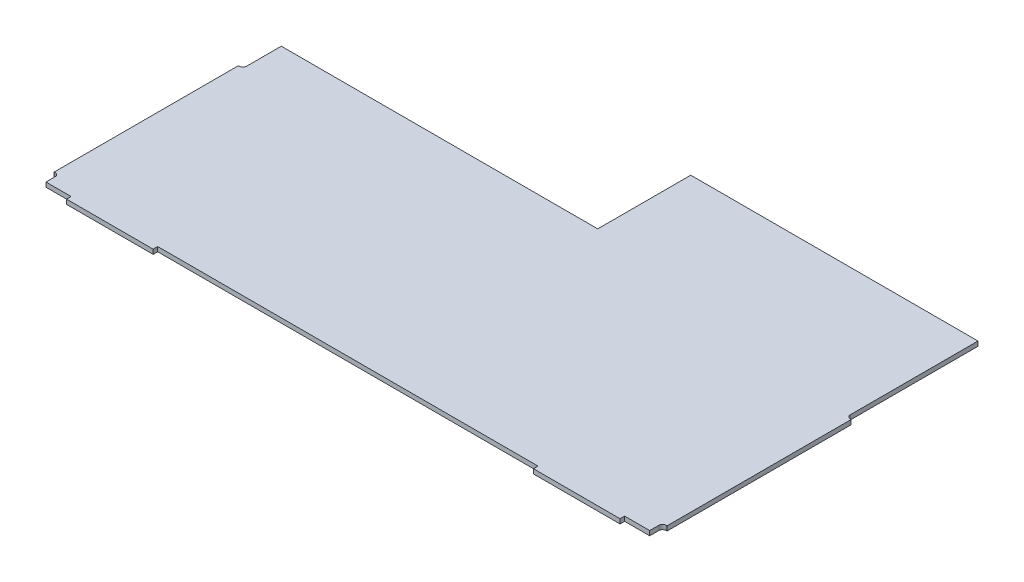
ISO-10303-21;
HEADER;
FILE_DESCRIPTION(('STEP AP214'),'2;1');
FILE_NAME('part.step','',(''),(''),'','','');
FILE_SCHEMA(('AUTOMOTIVE_DESIGN { 1 0 10303 214 1 1 1 1 }'));
ENDSEC;
DATA;
#1=APPLICATION_CONTEXT('core data for automotive mechanical design processes');
#2=APPLICATION_PROTOCOL_DEFINITION('international standard','automotive_design',2000,#1);
#3=PRODUCT_CONTEXT('',#1,'mechanical');
#4=PRODUCT('Part','Part','',(#3));
#5=PRODUCT_RELATED_PRODUCT_CATEGORY('part','',(#4));
#6=PRODUCT_DEFINITION_FORMATION('','',#4);
#7=PRODUCT_DEFINITION_CONTEXT('part definition',#1,'design');
#8=PRODUCT_DEFINITION('design','',#6,#7);
#9=PRODUCT_DEFINITION_SHAPE('','',#8);
#10=(LENGTH_UNIT() NAMED_UNIT(*) SI_UNIT(.MILLI.,.METRE.));
#11=(NAMED_UNIT(*) PLANE_ANGLE_UNIT() SI_UNIT($,.RADIAN.));
#12=(NAMED_UNIT(*) SI_UNIT($,.STERADIAN.) SOLID_ANGLE_UNIT());
#13=UNCERTAINTY_MEASURE_WITH_UNIT(LENGTH_MEASURE(1.E-05),#10,'distance_accuracy_value','');
#14=(GEOMETRIC_REPRESENTATION_CONTEXT(3) GLOBAL_UNCERTAINTY_ASSIGNED_CONTEXT((#13)) GLOBAL_UNIT_ASSIGNED_CONTEXT((#10,
#11,#12)) REPRESENTATION_CONTEXT('',''));
#15=CARTESIAN_POINT('',(0.,0.,0.));
#16=DIRECTION('',(0.,0.,1.));
#17=DIRECTION('',(1.,0.,0.));
#18=AXIS2_PLACEMENT_3D('',#15,#16,#17);
#19=CARTESIAN_POINT('',(196.370348369291,3.175,24.13));
#20=DIRECTION('',(0.,-1.,0.));
#21=DIRECTION('',(0.,0.,-1.));
#22=AXIS2_PLACEMENT_3D('',#19,#20,#21);
#23=CYLINDRICAL_SURFACE('',#22,2.54000000000001);
#24=CARTESIAN_POINT('',(196.370348369291,0.,24.13));
#25=DIRECTION('',(0.,-1.,0.));
#26=DIRECTION('',(0.,0.,1.));
#27=AXIS2_PLACEMENT_3D('',#24,#25,#26);
#28=CIRCLE('',#27,2.54000000000001);
#29=CARTESIAN_POINT('',(196.370348369291,0.,26.67));
#30=VERTEX_POINT('',#29);
#31=CARTESIAN_POINT('',(193.830348369291,0.,24.13));
#32=VERTEX_POINT('',#31);
#33=EDGE_CURVE('E235',#30,#32,#28,.T.);
#34=ORIENTED_EDGE('',*,*,#33,.T.);
#35=DIRECTION('',(0.,-1.,0.));
#36=VECTOR('',#35,1.);
#37=CARTESIAN_POINT('',(193.830348369291,3.175,24.13));
#38=LINE('',#37,#36);
#39=CARTESIAN_POINT('',(193.830348369291,3.175,24.13));
#40=VERTEX_POINT('',#39);
#41=EDGE_CURVE('E11',#40,#32,#38,.T.);
#42=ORIENTED_EDGE('',*,*,#41,.F.);
#43=CARTESIAN_POINT('',(196.370348369291,3.175,24.13));
#44=DIRECTION('',(0.,-1.,0.));
#45=DIRECTION('',(0.,0.,1.));
#46=AXIS2_PLACEMENT_3D('',#43,#44,#45);
#47=CIRCLE('',#46,2.54000000000001);
#48=CARTESIAN_POINT('',(196.370348369291,3.175,26.67));
#49=VERTEX_POINT('',#48);
#50=EDGE_CURVE('E230',#49,#40,#47,.T.);
#51=ORIENTED_EDGE('',*,*,#50,.F.);
#52=DIRECTION('',(0.,-1.,0.));
#53=VECTOR('',#52,1.);
#54=CARTESIAN_POINT('',(196.370348369291,3.175,26.67));
#55=LINE('',#54,#53);
#56=EDGE_CURVE('E225',#49,#30,#55,.T.);
#57=ORIENTED_EDGE('',*,*,#56,.T.);
#58=EDGE_LOOP('',(#34,#42,#51,#57));
#59=FACE_BOUND('',#58,.T.);
#60=ADVANCED_FACE('F36',(#59),#23,.F.);
#61=CARTESIAN_POINT('',(193.830348369291,3.175,-64.77));
#62=DIRECTION('',(-1.,0.,0.));
#63=DIRECTION('',(0.,0.,1.));
#64=AXIS2_PLACEMENT_3D('',#61,#62,#63);
#65=PLANE('',#64);
#66=DIRECTION('',(0.,0.,-1.));
#67=VECTOR('',#66,1.);
#68=CARTESIAN_POINT('',(193.830348369291,0.,-64.77));
#69=LINE('',#68,#67);
#70=CARTESIAN_POINT('',(193.830348369291,0.,-64.77));
#71=VERTEX_POINT('',#70);
#72=EDGE_CURVE('E241',#32,#71,#69,.T.);
#73=ORIENTED_EDGE('',*,*,#72,.T.);
#74=DIRECTION('',(0.,-1.,0.));
#75=VECTOR('',#74,1.);
#76=CARTESIAN_POINT('',(193.830348369291,3.175,-64.77));
#77=LINE('',#76,#75);
#78=CARTESIAN_POINT('',(193.830348369291,3.175,-64.77));
#79=VERTEX_POINT('',#78);
#80=EDGE_CURVE('E45',#79,#71,#77,.T.);
#81=ORIENTED_EDGE('',*,*,#80,.F.);
#82=DIRECTION('',(0.,0.,-1.));
#83=VECTOR('',#82,1.);
#84=CARTESIAN_POINT('',(193.830348369291,3.175,-64.77));
#85=LINE('',#84,#83);
#86=EDGE_CURVE('E408',#40,#79,#85,.T.);
#87=ORIENTED_EDGE('',*,*,#86,.F.);
#88=ORIENTED_EDGE('',*,*,#41,.T.);
#89=EDGE_LOOP('',(#73,#81,#87,#88));
#90=FACE_BOUND('',#89,.T.);
#91=ADVANCED_FACE('F410',(#90),#65,.F.);
#92=CARTESIAN_POINT('',(-6.1946516307094,3.175,-64.77));
#93=DIRECTION('',(0.,0.,1.));
#94=DIRECTION('',(1.,0.,0.));
#95=AXIS2_PLACEMENT_3D('',#92,#93,#94);
#96=PLANE('',#95);
#97=DIRECTION('',(-1.,0.,0.));
#98=VECTOR('',#97,1.);
#99=CARTESIAN_POINT('',(-6.1946516307094,0.,-64.77));
#100=LINE('',#99,#98);
#101=CARTESIAN_POINT('',(-6.1946516307094,0.,-64.77));
#102=VERTEX_POINT('',#101);
#103=EDGE_CURVE('E244',#71,#102,#100,.T.);
#104=ORIENTED_EDGE('',*,*,#103,.T.);
#105=DIRECTION('',(0.,-1.,0.));
#106=VECTOR('',#105,1.);
#107=CARTESIAN_POINT('',(-6.1946516307094,3.175,-64.77));
#108=LINE('',#107,#106);
#109=CARTESIAN_POINT('',(-6.1946516307094,3.175,-64.77));
#110=VERTEX_POINT('',#109);
#111=EDGE_CURVE('E342',#110,#102,#108,.T.);
#112=ORIENTED_EDGE('',*,*,#111,.F.);
#113=DIRECTION('',(-1.,0.,0.));
#114=VECTOR('',#113,1.);
#115=CARTESIAN_POINT('',(-6.1946516307094,3.175,-64.77));
#116=LINE('',#115,#114);
#117=EDGE_CURVE('E351',#79,#110,#116,.T.);
#118=ORIENTED_EDGE('',*,*,#117,.F.);
#119=ORIENTED_EDGE('',*,*,#80,.T.);
#120=EDGE_LOOP('',(#104,#112,#118,#119));
#121=FACE_BOUND('',#120,.T.);
#122=ADVANCED_FACE('F349',(#121),#96,.F.);
#123=CARTESIAN_POINT('',(-6.19465163070948,3.175,0.));
#124=DIRECTION('',(1.,0.,0.));
#125=DIRECTION('',(0.,0.,-1.));
#126=AXIS2_PLACEMENT_3D('',#123,#124,#125);
#127=PLANE('',#126);
#128=DIRECTION('',(0.,0.,1.));
#129=VECTOR('',#128,1.);
#130=CARTESIAN_POINT('',(-6.19465163070948,0.,0.));
#131=LINE('',#130,#129);
#132=CARTESIAN_POINT('',(-6.19465163070948,0.,0.));
#133=VERTEX_POINT('',#132);
#134=EDGE_CURVE('E251',#102,#133,#131,.T.);
#135=ORIENTED_EDGE('',*,*,#134,.T.);
#136=DIRECTION('',(0.,-1.,0.));
#137=VECTOR('',#136,1.);
#138=CARTESIAN_POINT('',(-6.19465163070948,3.175,0.));
#139=LINE('',#138,#137);
#140=CARTESIAN_POINT('',(-6.19465163070948,3.175,0.));
#141=VERTEX_POINT('',#140);
#142=EDGE_CURVE('E339',#141,#133,#139,.T.);
#143=ORIENTED_EDGE('',*,*,#142,.F.);
#144=DIRECTION('',(0.,0.,1.));
#145=VECTOR('',#144,1.);
#146=CARTESIAN_POINT('',(-6.19465163070948,3.175,0.));
#147=LINE('',#146,#145);
#148=EDGE_CURVE('E368',#110,#141,#147,.T.);
#149=ORIENTED_EDGE('',*,*,#148,.F.);
#150=ORIENTED_EDGE('',*,*,#111,.T.);
#151=EDGE_LOOP('',(#135,#143,#149,#150));
#152=FACE_BOUND('',#151,.T.);
#153=ADVANCED_FACE('F358',(#152),#127,.F.);
#154=CARTESIAN_POINT('',(-226.539651630709,3.175,0.));
#155=DIRECTION('',(0.,0.,1.));
#156=DIRECTION('',(1.,0.,0.));
#157=AXIS2_PLACEMENT_3D('',#154,#155,#156);
#158=PLANE('',#157);
#159=DIRECTION('',(-1.,0.,0.));
#160=VECTOR('',#159,1.);
#161=CARTESIAN_POINT('',(-226.539651630709,0.,0.));
#162=LINE('',#161,#160);
#163=CARTESIAN_POINT('',(-226.539651630709,0.,0.));
#164=VERTEX_POINT('',#163);
#165=EDGE_CURVE('E253',#133,#164,#162,.T.);
#166=ORIENTED_EDGE('',*,*,#165,.T.);
#167=DIRECTION('',(0.,-1.,0.));
#168=VECTOR('',#167,1.);
#169=CARTESIAN_POINT('',(-226.539651630709,3.175,0.));
#170=LINE('',#169,#168);
#171=CARTESIAN_POINT('',(-226.539651630709,3.175,0.));
#172=VERTEX_POINT('',#171);
#173=EDGE_CURVE('E336',#172,#164,#170,.T.);
#174=ORIENTED_EDGE('',*,*,#173,.F.);
#175=DIRECTION('',(-1.,0.,0.));
#176=VECTOR('',#175,1.);
#177=CARTESIAN_POINT('',(-226.539651630709,3.175,0.));
#178=LINE('',#177,#176);
#179=EDGE_CURVE('E364',#141,#172,#178,.T.);
#180=ORIENTED_EDGE('',*,*,#179,.F.);
#181=ORIENTED_EDGE('',*,*,#142,.T.);
#182=EDGE_LOOP('',(#166,#174,#180,#181));
#183=FACE_BOUND('',#182,.T.);
#184=ADVANCED_FACE('F362',(#183),#158,.F.);
#185=CARTESIAN_POINT('',(-226.539651630709,3.175,0.));
#186=DIRECTION('',(1.,0.,0.));
#187=DIRECTION('',(0.,0.,-1.));
#188=AXIS2_PLACEMENT_3D('',#185,#186,#187);
#189=PLANE('',#188);
#190=DIRECTION('',(0.,0.,1.));
#191=VECTOR('',#190,1.);
#192=CARTESIAN_POINT('',(-226.539651630709,0.,0.));
#193=LINE('',#192,#191);
#194=CARTESIAN_POINT('',(-226.539651630709,0.,24.13));
#195=VERTEX_POINT('',#194);
#196=EDGE_CURVE('E255',#164,#195,#193,.T.);
#197=ORIENTED_EDGE('',*,*,#196,.T.);
#198=DIRECTION('',(0.,-1.,0.));
#199=VECTOR('',#198,1.);
#200=CARTESIAN_POINT('',(-226.539651630709,3.175,24.13));
#201=LINE('',#200,#199);
#202=CARTESIAN_POINT('',(-226.539651630709,3.175,24.13));
#203=VERTEX_POINT('',#202);
#204=EDGE_CURVE('E333',#203,#195,#201,.T.);
#205=ORIENTED_EDGE('',*,*,#204,.F.);
#206=DIRECTION('',(0.,0.,1.));
#207=VECTOR('',#206,1.);
#208=CARTESIAN_POINT('',(-226.539651630709,3.175,0.));
#209=LINE('',#208,#207);
#210=EDGE_CURVE('E367',#172,#203,#209,.T.);
#211=ORIENTED_EDGE('',*,*,#210,.F.);
#212=ORIENTED_EDGE('',*,*,#173,.T.);
#213=EDGE_LOOP('',(#197,#205,#211,#212));
#214=FACE_BOUND('',#213,.T.);
#215=ADVANCED_FACE('F501',(#214),#189,.F.);
#216=CARTESIAN_POINT('',(-229.079651630709,3.175,24.13));
#217=DIRECTION('',(0.,-1.,0.));
#218=DIRECTION('',(0.,0.,-1.));
#219=AXIS2_PLACEMENT_3D('',#216,#217,#218);
#220=CYLINDRICAL_SURFACE('',#219,2.53999999999998);
#221=CARTESIAN_POINT('',(-229.079651630709,0.,24.13));
#222=DIRECTION('',(0.,-1.,0.));
#223=DIRECTION('',(0.,0.,-1.));
#224=AXIS2_PLACEMENT_3D('',#221,#222,#223);
#225=CIRCLE('',#224,2.53999999999998);
#226=CARTESIAN_POINT('',(-229.079651630709,0.,26.67));
#227=VERTEX_POINT('',#226);
#228=EDGE_CURVE('E257',#195,#227,#225,.T.);
#229=ORIENTED_EDGE('',*,*,#228,.T.);
#230=DIRECTION('',(0.,-1.,0.));
#231=VECTOR('',#230,1.);
#232=CARTESIAN_POINT('',(-229.079651630709,3.175,26.67));
#233=LINE('',#232,#231);
#234=CARTESIAN_POINT('',(-229.079651630709,3.175,26.67));
#235=VERTEX_POINT('',#234);
#236=EDGE_CURVE('E330',#235,#227,#233,.T.);
#237=ORIENTED_EDGE('',*,*,#236,.F.);
#238=CARTESIAN_POINT('',(-229.079651630709,3.175,24.13));
#239=DIRECTION('',(0.,-1.,0.));
#240=DIRECTION('',(0.,0.,-1.));
#241=AXIS2_PLACEMENT_3D('',#238,#239,#240);
#242=CIRCLE('',#241,2.53999999999998);
#243=EDGE_CURVE('E370',#203,#235,#242,.T.);
#244=ORIENTED_EDGE('',*,*,#243,.F.);
#245=ORIENTED_EDGE('',*,*,#204,.T.);
#246=EDGE_LOOP('',(#229,#237,#244,#245));
#247=FACE_BOUND('',#246,.T.);
#248=ADVANCED_FACE('F498',(#247),#220,.F.);
#249=CARTESIAN_POINT('',(-229.079651630709,3.175,26.67));
#250=DIRECTION('',(0.,0.,1.));
#251=DIRECTION('',(1.,0.,0.));
#252=AXIS2_PLACEMENT_3D('',#249,#250,#251);
#253=PLANE('',#252);
#254=DIRECTION('',(-1.,0.,0.));
#255=VECTOR('',#254,1.);
#256=CARTESIAN_POINT('',(-229.079651630709,0.,26.67));
#257=LINE('',#256,#255);
#258=CARTESIAN_POINT('',(-229.714651630709,0.,26.67));
#259=VERTEX_POINT('',#258);
#260=EDGE_CURVE('E259',#227,#259,#257,.T.);
#261=ORIENTED_EDGE('',*,*,#260,.T.);
#262=DIRECTION('',(0.,-1.,0.));
#263=VECTOR('',#262,1.);
#264=CARTESIAN_POINT('',(-229.714651630709,3.175,26.67));
#265=LINE('',#264,#263);
#266=CARTESIAN_POINT('',(-229.714651630709,3.175,26.67));
#267=VERTEX_POINT('',#266);
#268=EDGE_CURVE('E327',#267,#259,#265,.T.);
#269=ORIENTED_EDGE('',*,*,#268,.F.);
#270=DIRECTION('',(-1.,0.,0.));
#271=VECTOR('',#270,1.);
#272=CARTESIAN_POINT('',(-229.079651630709,3.175,26.67));
#273=LINE('',#272,#271);
#274=EDGE_CURVE('E376',#235,#267,#273,.T.);
#275=ORIENTED_EDGE('',*,*,#274,.F.);
#276=ORIENTED_EDGE('',*,*,#236,.T.);
#277=EDGE_LOOP('',(#261,#269,#275,#276));
#278=FACE_BOUND('',#277,.T.);
#279=ADVANCED_FACE('F493',(#278),#253,.F.);
#280=CARTESIAN_POINT('',(-229.714651630709,3.175,154.94));
#281=DIRECTION('',(1.,0.,0.));
#282=DIRECTION('',(0.,0.,-1.));
#283=AXIS2_PLACEMENT_3D('',#280,#281,#282);
#284=PLANE('',#283);
#285=DIRECTION('',(0.,0.,1.));
#286=VECTOR('',#285,1.);
#287=CARTESIAN_POINT('',(-229.714651630709,0.,154.94));
#288=LINE('',#287,#286);
#289=CARTESIAN_POINT('',(-229.714651630709,0.,154.94));
#290=VERTEX_POINT('',#289);
#291=EDGE_CURVE('E261',#259,#290,#288,.T.);
#292=ORIENTED_EDGE('',*,*,#291,.T.);
#293=DIRECTION('',(0.,-1.,0.));
#294=VECTOR('',#293,1.);
#295=CARTESIAN_POINT('',(-229.714651630709,3.175,154.94));
#296=LINE('',#295,#294);
#297=CARTESIAN_POINT('',(-229.714651630709,3.175,154.94));
#298=VERTEX_POINT('',#297);
#299=EDGE_CURVE('E324',#298,#290,#296,.T.);
#300=ORIENTED_EDGE('',*,*,#299,.F.);
#301=DIRECTION('',(0.,0.,1.));
#302=VECTOR('',#301,1.);
#303=CARTESIAN_POINT('',(-229.714651630709,3.175,154.94));
#304=LINE('',#303,#302);
#305=EDGE_CURVE('E378',#267,#298,#304,.T.);
#306=ORIENTED_EDGE('',*,*,#305,.F.);
#307=ORIENTED_EDGE('',*,*,#268,.T.);
#308=EDGE_LOOP('',(#292,#300,#306,#307));
#309=FACE_BOUND('',#308,.T.);
#310=ADVANCED_FACE('F488',(#309),#284,.F.);
#311=CARTESIAN_POINT('',(-229.714651630709,3.175,154.94));
#312=DIRECTION('',(0.,0.,-1.));
#313=DIRECTION('',(-1.,0.,0.));
#314=AXIS2_PLACEMENT_3D('',#311,#312,#313);
#315=PLANE('',#314);
#316=DIRECTION('',(1.,0.,0.));
#317=VECTOR('',#316,1.);
#318=CARTESIAN_POINT('',(-229.714651630709,0.,154.94));
#319=LINE('',#318,#317);
#320=CARTESIAN_POINT('',(-229.079651630709,0.,154.94));
#321=VERTEX_POINT('',#320);
#322=EDGE_CURVE('E263',#290,#321,#319,.T.);
#323=ORIENTED_EDGE('',*,*,#322,.T.);
#324=DIRECTION('',(0.,-1.,0.));
#325=VECTOR('',#324,1.);
#326=CARTESIAN_POINT('',(-229.079651630709,3.175,154.94));
#327=LINE('',#326,#325);
#328=CARTESIAN_POINT('',(-229.079651630709,3.175,154.94));
#329=VERTEX_POINT('',#328);
#330=EDGE_CURVE('E321',#329,#321,#327,.T.);
#331=ORIENTED_EDGE('',*,*,#330,.F.);
#332=DIRECTION('',(1.,0.,0.));
#333=VECTOR('',#332,1.);
#334=CARTESIAN_POINT('',(-229.714651630709,3.175,154.94));
#335=LINE('',#334,#333);
#336=EDGE_CURVE('E380',#298,#329,#335,.T.);
#337=ORIENTED_EDGE('',*,*,#336,.F.);
#338=ORIENTED_EDGE('',*,*,#299,.T.);
#339=EDGE_LOOP('',(#323,#331,#337,#338));
#340=FACE_BOUND('',#339,.T.);
#341=ADVANCED_FACE('F484',(#340),#315,.F.);
#342=CARTESIAN_POINT('',(-229.079651630709,3.175,157.48));
#343=DIRECTION('',(0.,-1.,0.));
#344=DIRECTION('',(0.,0.,-1.));
#345=AXIS2_PLACEMENT_3D('',#342,#343,#344);
#346=CYLINDRICAL_SURFACE('',#345,2.53999999999999);
#347=CARTESIAN_POINT('',(-229.079651630709,0.,157.48));
#348=DIRECTION('',(0.,-1.,0.));
#349=DIRECTION('',(0.,0.,-1.));
#350=AXIS2_PLACEMENT_3D('',#347,#348,#349);
#351=CIRCLE('',#350,2.53999999999999);
#352=CARTESIAN_POINT('',(-226.539651630709,0.,157.48));
#353=VERTEX_POINT('',#352);
#354=EDGE_CURVE('E265',#321,#353,#351,.T.);
#355=ORIENTED_EDGE('',*,*,#354,.T.);
#356=DIRECTION('',(0.,-1.,0.));
#357=VECTOR('',#356,1.);
#358=CARTESIAN_POINT('',(-226.539651630709,3.175,157.48));
#359=LINE('',#358,#357);
#360=CARTESIAN_POINT('',(-226.539651630709,3.175,157.48));
#361=VERTEX_POINT('',#360);
#362=EDGE_CURVE('E318',#361,#353,#359,.T.);
#363=ORIENTED_EDGE('',*,*,#362,.F.);
#364=CARTESIAN_POINT('',(-229.079651630709,3.175,157.48));
#365=DIRECTION('',(0.,-1.,0.));
#366=DIRECTION('',(0.,0.,-1.));
#367=AXIS2_PLACEMENT_3D('',#364,#365,#366);
#368=CIRCLE('',#367,2.53999999999999);
#369=EDGE_CURVE('E382',#329,#361,#368,.T.);
#370=ORIENTED_EDGE('',*,*,#369,.F.);
#371=ORIENTED_EDGE('',*,*,#330,.T.);
#372=EDGE_LOOP('',(#355,#363,#370,#371));
#373=FACE_BOUND('',#372,.T.);
#374=ADVANCED_FACE('F479',(#373),#346,.F.);
#375=CARTESIAN_POINT('',(-226.539651630709,3.175,157.48));
#376=DIRECTION('',(1.,0.,0.));
#377=DIRECTION('',(0.,0.,-1.));
#378=AXIS2_PLACEMENT_3D('',#375,#376,#377);
#379=PLANE('',#378);
#380=DIRECTION('',(0.,0.,1.));
#381=VECTOR('',#380,1.);
#382=CARTESIAN_POINT('',(-226.539651630709,0.,157.48));
#383=LINE('',#382,#381);
#384=CARTESIAN_POINT('',(-226.539651630709,0.,163.83));
#385=VERTEX_POINT('',#384);
#386=EDGE_CURVE('E267',#353,#385,#383,.T.);
#387=ORIENTED_EDGE('',*,*,#386,.T.);
#388=DIRECTION('',(0.,-1.,0.));
#389=VECTOR('',#388,1.);
#390=CARTESIAN_POINT('',(-226.539651630709,3.175,163.83));
#391=LINE('',#390,#389);
#392=CARTESIAN_POINT('',(-226.539651630709,3.175,163.83));
#393=VERTEX_POINT('',#392);
#394=EDGE_CURVE('E315',#393,#385,#391,.T.);
#395=ORIENTED_EDGE('',*,*,#394,.F.);
#396=DIRECTION('',(0.,0.,1.));
#397=VECTOR('',#396,1.);
#398=CARTESIAN_POINT('',(-226.539651630709,3.175,157.48));
#399=LINE('',#398,#397);
#400=EDGE_CURVE('E384',#361,#393,#399,.T.);
#401=ORIENTED_EDGE('',*,*,#400,.F.);
#402=ORIENTED_EDGE('',*,*,#362,.T.);
#403=EDGE_LOOP('',(#387,#395,#401,#402));
#404=FACE_BOUND('',#403,.T.);
#405=ADVANCED_FACE('F473',(#404),#379,.F.);
#406=CARTESIAN_POINT('',(-209.077151630709,3.175,163.83));
#407=DIRECTION('',(0.,0.,-1.));
#408=DIRECTION('',(-1.,0.,0.));
#409=AXIS2_PLACEMENT_3D('',#406,#407,#408);
#410=PLANE('',#409);
#411=DIRECTION('',(1.,0.,0.));
#412=VECTOR('',#411,1.);
#413=CARTESIAN_POINT('',(-209.077151630709,0.,163.83));
#414=LINE('',#413,#412);
#415=CARTESIAN_POINT('',(-209.077151630709,0.,163.83));
#416=VERTEX_POINT('',#415);
#417=EDGE_CURVE('E269',#385,#416,#414,.T.);
#418=ORIENTED_EDGE('',*,*,#417,.T.);
#419=DIRECTION('',(0.,-1.,0.));
#420=VECTOR('',#419,1.);
#421=CARTESIAN_POINT('',(-209.077151630709,3.175,163.83));
#422=LINE('',#421,#420);
#423=CARTESIAN_POINT('',(-209.077151630709,3.175,163.83));
#424=VERTEX_POINT('',#423);
#425=EDGE_CURVE('E312',#424,#416,#422,.T.);
#426=ORIENTED_EDGE('',*,*,#425,.F.);
#427=DIRECTION('',(1.,0.,0.));
#428=VECTOR('',#427,1.);
#429=CARTESIAN_POINT('',(-209.077151630709,3.175,163.83));
#430=LINE('',#429,#428);
#431=EDGE_CURVE('E386',#393,#424,#430,.T.);
#432=ORIENTED_EDGE('',*,*,#431,.F.);
#433=ORIENTED_EDGE('',*,*,#394,.T.);
#434=EDGE_LOOP('',(#418,#426,#432,#433));
#435=FACE_BOUND('',#434,.T.);
#436=ADVANCED_FACE('F469',(#435),#410,.F.);
#437=CARTESIAN_POINT('',(-209.077151630709,3.175,163.83));
#438=DIRECTION('',(1.,0.,0.));
#439=DIRECTION('',(0.,0.,-1.));
#440=AXIS2_PLACEMENT_3D('',#437,#438,#439);
#441=PLANE('',#440);
#442=DIRECTION('',(0.,0.,1.));
#443=VECTOR('',#442,1.);
#444=CARTESIAN_POINT('',(-209.077151630709,0.,163.83));
#445=LINE('',#444,#443);
#446=CARTESIAN_POINT('',(-209.077151630709,0.,167.005));
#447=VERTEX_POINT('',#446);
#448=EDGE_CURVE('E271',#416,#447,#445,.T.);
#449=ORIENTED_EDGE('',*,*,#448,.T.);
#450=DIRECTION('',(0.,-1.,0.));
#451=VECTOR('',#450,1.);
#452=CARTESIAN_POINT('',(-209.077151630709,3.175,167.005));
#453=LINE('',#452,#451);
#454=CARTESIAN_POINT('',(-209.077151630709,3.175,167.005));
#455=VERTEX_POINT('',#454);
#456=EDGE_CURVE('E309',#455,#447,#453,.T.);
#457=ORIENTED_EDGE('',*,*,#456,.F.);
#458=DIRECTION('',(0.,0.,1.));
#459=VECTOR('',#458,1.);
#460=CARTESIAN_POINT('',(-209.077151630709,3.175,163.83));
#461=LINE('',#460,#459);
#462=EDGE_CURVE('E388',#424,#455,#461,.T.);
#463=ORIENTED_EDGE('',*,*,#462,.F.);
#464=ORIENTED_EDGE('',*,*,#425,.T.);
#465=EDGE_LOOP('',(#449,#457,#463,#464));
#466=FACE_BOUND('',#465,.T.);
#467=ADVANCED_FACE('F464',(#466),#441,.F.);
#468=CARTESIAN_POINT('',(-209.077151630709,3.175,167.005));
#469=DIRECTION('',(0.,0.,-1.));
#470=DIRECTION('',(-1.,0.,0.));
#471=AXIS2_PLACEMENT_3D('',#468,#469,#470);
#472=PLANE('',#471);
#473=DIRECTION('',(1.,0.,0.));
#474=VECTOR('',#473,1.);
#475=CARTESIAN_POINT('',(-209.077151630709,0.,167.005));
#476=LINE('',#475,#474);
#477=CARTESIAN_POINT('',(-148.752151630709,0.,167.005));
#478=VERTEX_POINT('',#477);
#479=EDGE_CURVE('E273',#447,#478,#476,.T.);
#480=ORIENTED_EDGE('',*,*,#479,.T.);
#481=DIRECTION('',(0.,-1.,0.));
#482=VECTOR('',#481,1.);
#483=CARTESIAN_POINT('',(-148.752151630709,3.175,167.005));
#484=LINE('',#483,#482);
#485=CARTESIAN_POINT('',(-148.752151630709,3.175,167.005));
#486=VERTEX_POINT('',#485);
#487=EDGE_CURVE('E306',#486,#478,#484,.T.);
#488=ORIENTED_EDGE('',*,*,#487,.F.);
#489=DIRECTION('',(1.,0.,0.));
#490=VECTOR('',#489,1.);
#491=CARTESIAN_POINT('',(-209.077151630709,3.175,167.005));
#492=LINE('',#491,#490);
#493=EDGE_CURVE('E390',#455,#486,#492,.T.);
#494=ORIENTED_EDGE('',*,*,#493,.F.);
#495=ORIENTED_EDGE('',*,*,#456,.T.);
#496=EDGE_LOOP('',(#480,#488,#494,#495));
#497=FACE_BOUND('',#496,.T.);
#498=ADVANCED_FACE('F458',(#497),#472,.F.);
#499=CARTESIAN_POINT('',(-148.752151630709,3.175,167.005));
#500=DIRECTION('',(-1.,0.,0.));
#501=DIRECTION('',(0.,0.,1.));
#502=AXIS2_PLACEMENT_3D('',#499,#500,#501);
#503=PLANE('',#502);
#504=DIRECTION('',(0.,0.,-1.));
#505=VECTOR('',#504,1.);
#506=CARTESIAN_POINT('',(-148.752151630709,0.,167.005));
#507=LINE('',#506,#505);
#508=CARTESIAN_POINT('',(-148.752151630709,0.,163.83));
#509=VERTEX_POINT('',#508);
#510=EDGE_CURVE('E275',#478,#509,#507,.T.);
#511=ORIENTED_EDGE('',*,*,#510,.T.);
#512=DIRECTION('',(0.,-1.,0.));
#513=VECTOR('',#512,1.);
#514=CARTESIAN_POINT('',(-148.752151630709,3.175,163.83));
#515=LINE('',#514,#513);
#516=CARTESIAN_POINT('',(-148.752151630709,3.175,163.83));
#517=VERTEX_POINT('',#516);
#518=EDGE_CURVE('E303',#517,#509,#515,.T.);
#519=ORIENTED_EDGE('',*,*,#518,.F.);
#520=DIRECTION('',(0.,0.,-1.));
#521=VECTOR('',#520,1.);
#522=CARTESIAN_POINT('',(-148.752151630709,3.175,167.005));
#523=LINE('',#522,#521);
#524=EDGE_CURVE('E392',#486,#517,#523,.T.);
#525=ORIENTED_EDGE('',*,*,#524,.F.);
#526=ORIENTED_EDGE('',*,*,#487,.T.);
#527=EDGE_LOOP('',(#511,#519,#525,#526));
#528=FACE_BOUND('',#527,.T.);
#529=ADVANCED_FACE('F453',(#528),#503,.F.);
#530=CARTESIAN_POINT('',(116.042848369291,3.175,163.83));
#531=DIRECTION('',(0.,0.,-1.));
#532=DIRECTION('',(-1.,0.,0.));
#533=AXIS2_PLACEMENT_3D('',#530,#531,#532);
#534=PLANE('',#533);
#535=DIRECTION('',(1.,0.,0.));
#536=VECTOR('',#535,1.);
#537=CARTESIAN_POINT('',(116.042848369291,0.,163.83));
#538=LINE('',#537,#536);
#539=CARTESIAN_POINT('',(116.042848369291,0.,163.83));
#540=VERTEX_POINT('',#539);
#541=EDGE_CURVE('E278',#509,#540,#538,.T.);
#542=ORIENTED_EDGE('',*,*,#541,.T.);
#543=DIRECTION('',(0.,-1.,0.));
#544=VECTOR('',#543,1.);
#545=CARTESIAN_POINT('',(116.042848369291,3.175,163.83));
#546=LINE('',#545,#544);
#547=CARTESIAN_POINT('',(116.042848369291,3.175,163.83));
#548=VERTEX_POINT('',#547);
#549=EDGE_CURVE('E300',#548,#540,#546,.T.);
#550=ORIENTED_EDGE('',*,*,#549,.F.);
#551=DIRECTION('',(1.,0.,0.));
#552=VECTOR('',#551,1.);
#553=CARTESIAN_POINT('',(-148.752151630709,3.175,163.83));
#554=LINE('',#553,#552);
#555=EDGE_CURVE('E394',#517,#548,#554,.T.);
#556=ORIENTED_EDGE('',*,*,#555,.F.);
#557=ORIENTED_EDGE('',*,*,#518,.T.);
#558=EDGE_LOOP('',(#542,#550,#556,#557));
#559=FACE_BOUND('',#558,.T.);
#560=ADVANCED_FACE('F448',(#559),#534,.F.);
#561=CARTESIAN_POINT('',(116.042848369291,3.175,167.005));
#562=DIRECTION('',(1.,0.,0.));
#563=DIRECTION('',(0.,0.,-1.));
#564=AXIS2_PLACEMENT_3D('',#561,#562,#563);
#565=PLANE('',#564);
#566=DIRECTION('',(0.,0.,1.));
#567=VECTOR('',#566,1.);
#568=CARTESIAN_POINT('',(116.042848369291,0.,167.005));
#569=LINE('',#568,#567);
#570=CARTESIAN_POINT('',(116.042848369291,0.,167.005));
#571=VERTEX_POINT('',#570);
#572=EDGE_CURVE('E280',#540,#571,#569,.T.);
#573=ORIENTED_EDGE('',*,*,#572,.T.);
#574=DIRECTION('',(0.,-1.,0.));
#575=VECTOR('',#574,1.);
#576=CARTESIAN_POINT('',(116.042848369291,3.175,167.005));
#577=LINE('',#576,#575);
#578=CARTESIAN_POINT('',(116.042848369291,3.175,167.005));
#579=VERTEX_POINT('',#578);
#580=EDGE_CURVE('E297',#579,#571,#577,.T.);
#581=ORIENTED_EDGE('',*,*,#580,.F.);
#582=DIRECTION('',(0.,0.,1.));
#583=VECTOR('',#582,1.);
#584=CARTESIAN_POINT('',(116.042848369291,3.175,167.005));
#585=LINE('',#584,#583);
#586=EDGE_CURVE('E396',#548,#579,#585,.T.);
#587=ORIENTED_EDGE('',*,*,#586,.F.);
#588=ORIENTED_EDGE('',*,*,#549,.T.);
#589=EDGE_LOOP('',(#573,#581,#587,#588));
#590=FACE_BOUND('',#589,.T.);
#591=ADVANCED_FACE('F444',(#590),#565,.F.);
#592=CARTESIAN_POINT('',(176.367848369291,3.175,167.005));
#593=DIRECTION('',(0.,0.,-1.));
#594=DIRECTION('',(-1.,0.,0.));
#595=AXIS2_PLACEMENT_3D('',#592,#593,#594);
#596=PLANE('',#595);
#597=DIRECTION('',(1.,0.,0.));
#598=VECTOR('',#597,1.);
#599=CARTESIAN_POINT('',(176.367848369291,0.,167.005));
#600=LINE('',#599,#598);
#601=CARTESIAN_POINT('',(176.367848369291,0.,167.005));
#602=VERTEX_POINT('',#601);
#603=EDGE_CURVE('E282',#571,#602,#600,.T.);
#604=ORIENTED_EDGE('',*,*,#603,.T.);
#605=DIRECTION('',(0.,-1.,0.));
#606=VECTOR('',#605,1.);
#607=CARTESIAN_POINT('',(176.367848369291,3.175,167.005));
#608=LINE('',#607,#606);
#609=CARTESIAN_POINT('',(176.367848369291,3.175,167.005));
#610=VERTEX_POINT('',#609);
#611=EDGE_CURVE('E294',#610,#602,#608,.T.);
#612=ORIENTED_EDGE('',*,*,#611,.F.);
#613=DIRECTION('',(1.,0.,0.));
#614=VECTOR('',#613,1.);
#615=CARTESIAN_POINT('',(176.367848369291,3.175,167.005));
#616=LINE('',#615,#614);
#617=EDGE_CURVE('E398',#579,#610,#616,.T.);
#618=ORIENTED_EDGE('',*,*,#617,.F.);
#619=ORIENTED_EDGE('',*,*,#580,.T.);
#620=EDGE_LOOP('',(#604,#612,#618,#619));
#621=FACE_BOUND('',#620,.T.);
#622=ADVANCED_FACE('F439',(#621),#596,.F.);
#623=CARTESIAN_POINT('',(176.367848369291,3.175,163.83));
#624=DIRECTION('',(-1.,0.,0.));
#625=DIRECTION('',(0.,0.,1.));
#626=AXIS2_PLACEMENT_3D('',#623,#624,#625);
#627=PLANE('',#626);
#628=DIRECTION('',(0.,0.,-1.));
#629=VECTOR('',#628,1.);
#630=CARTESIAN_POINT('',(176.367848369291,0.,163.83));
#631=LINE('',#630,#629);
#632=CARTESIAN_POINT('',(176.367848369291,0.,163.83));
#633=VERTEX_POINT('',#632);
#634=EDGE_CURVE('E284',#602,#633,#631,.T.);
#635=ORIENTED_EDGE('',*,*,#634,.T.);
#636=DIRECTION('',(0.,-1.,0.));
#637=VECTOR('',#636,1.);
#638=CARTESIAN_POINT('',(176.367848369291,3.175,163.83));
#639=LINE('',#638,#637);
#640=CARTESIAN_POINT('',(176.367848369291,3.175,163.83));
#641=VERTEX_POINT('',#640);
#642=EDGE_CURVE('E291',#641,#633,#639,.T.);
#643=ORIENTED_EDGE('',*,*,#642,.F.);
#644=DIRECTION('',(0.,0.,-1.));
#645=VECTOR('',#644,1.);
#646=CARTESIAN_POINT('',(176.367848369291,3.175,163.83));
#647=LINE('',#646,#645);
#648=EDGE_CURVE('E400',#610,#641,#647,.T.);
#649=ORIENTED_EDGE('',*,*,#648,.F.);
#650=ORIENTED_EDGE('',*,*,#611,.T.);
#651=EDGE_LOOP('',(#635,#643,#649,#650));
#652=FACE_BOUND('',#651,.T.);
#653=ADVANCED_FACE('F434',(#652),#627,.F.);
#654=CARTESIAN_POINT('',(197.005348369291,3.175,163.83));
#655=DIRECTION('',(0.,0.,-1.));
#656=DIRECTION('',(-1.,0.,0.));
#657=AXIS2_PLACEMENT_3D('',#654,#655,#656);
#658=PLANE('',#657);
#659=DIRECTION('',(1.,0.,0.));
#660=VECTOR('',#659,1.);
#661=CARTESIAN_POINT('',(197.005348369291,0.,163.83));
#662=LINE('',#661,#660);
#663=CARTESIAN_POINT('',(193.830348369291,0.,163.83));
#664=VERTEX_POINT('',#663);
#665=EDGE_CURVE('E286',#633,#664,#662,.T.);
#666=ORIENTED_EDGE('',*,*,#665,.T.);
#667=DIRECTION('',(0.,1.,0.));
#668=VECTOR('',#667,1.);
#669=CARTESIAN_POINT('',(193.830348369291,0.,163.83));
#670=LINE('',#669,#668);
#671=CARTESIAN_POINT('',(193.830348369291,3.175,163.83));
#672=VERTEX_POINT('',#671);
#673=EDGE_CURVE('E414',#664,#672,#670,.T.);
#674=ORIENTED_EDGE('',*,*,#673,.T.);
#675=DIRECTION('',(1.,0.,0.));
#676=VECTOR('',#675,1.);
#677=CARTESIAN_POINT('',(197.005348369291,3.175,163.83));
#678=LINE('',#677,#676);
#679=EDGE_CURVE('E402',#641,#672,#678,.T.);
#680=ORIENTED_EDGE('',*,*,#679,.F.);
#681=ORIENTED_EDGE('',*,*,#642,.T.);
#682=EDGE_LOOP('',(#666,#674,#680,#681));
#683=FACE_BOUND('',#682,.T.);
#684=ADVANCED_FACE('F429',(#683),#658,.F.);
#685=CARTESIAN_POINT('',(197.005348369291,3.175,26.67));
#686=DIRECTION('',(-1.,0.,0.));
#687=DIRECTION('',(0.,0.,1.));
#688=AXIS2_PLACEMENT_3D('',#685,#686,#687);
#689=PLANE('',#688);
#690=DIRECTION('',(0.,0.,-1.));
#691=VECTOR('',#690,1.);
#692=CARTESIAN_POINT('',(197.005348369291,3.175,26.67));
#693=LINE('',#692,#691);
#694=CARTESIAN_POINT('',(197.005348369291,3.175,154.94));
#695=VERTEX_POINT('',#694);
#696=CARTESIAN_POINT('',(197.005348369291,3.175,26.67));
#697=VERTEX_POINT('',#696);
#698=EDGE_CURVE('E404',#695,#697,#693,.T.);
#699=ORIENTED_EDGE('',*,*,#698,.F.);
#700=DIRECTION('',(0.,1.,0.));
#701=VECTOR('',#700,1.);
#702=CARTESIAN_POINT('',(197.005348369291,0.,154.94));
#703=LINE('',#702,#701);
#704=CARTESIAN_POINT('',(197.005348369291,0.,154.94));
#705=VERTEX_POINT('',#704);
#706=EDGE_CURVE('E418',#705,#695,#703,.T.);
#707=ORIENTED_EDGE('',*,*,#706,.F.);
#708=DIRECTION('',(0.,0.,-1.));
#709=VECTOR('',#708,1.);
#710=CARTESIAN_POINT('',(197.005348369291,0.,26.67));
#711=LINE('',#710,#709);
#712=CARTESIAN_POINT('',(197.005348369291,0.,26.67));
#713=VERTEX_POINT('',#712);
#714=EDGE_CURVE('E215',#705,#713,#711,.T.);
#715=ORIENTED_EDGE('',*,*,#714,.T.);
#716=DIRECTION('',(0.,-1.,0.));
#717=VECTOR('',#716,1.);
#718=CARTESIAN_POINT('',(197.005348369291,3.175,26.67));
#719=LINE('',#718,#717);
#720=EDGE_CURVE('E227',#697,#713,#719,.T.);
#721=ORIENTED_EDGE('',*,*,#720,.F.);
#722=EDGE_LOOP('',(#699,#707,#715,#721));
#723=FACE_BOUND('',#722,.T.);
#724=ADVANCED_FACE('F559',(#723),#689,.F.);
#725=CARTESIAN_POINT('',(196.370348369291,3.175,26.67));
#726=DIRECTION('',(0.,0.,1.));
#727=DIRECTION('',(1.,0.,0.));
#728=AXIS2_PLACEMENT_3D('',#725,#726,#727);
#729=PLANE('',#728);
#730=DIRECTION('',(-1.,0.,0.));
#731=VECTOR('',#730,1.);
#732=CARTESIAN_POINT('',(196.370348369291,0.,26.67));
#733=LINE('',#732,#731);
#734=EDGE_CURVE('E221',#713,#30,#733,.T.);
#735=ORIENTED_EDGE('',*,*,#734,.T.);
#736=ORIENTED_EDGE('',*,*,#56,.F.);
#737=DIRECTION('',(-1.,0.,0.));
#738=VECTOR('',#737,1.);
#739=CARTESIAN_POINT('',(196.370348369291,3.175,26.67));
#740=LINE('',#739,#738);
#741=EDGE_CURVE('E237',#697,#49,#740,.T.);
#742=ORIENTED_EDGE('',*,*,#741,.F.);
#743=ORIENTED_EDGE('',*,*,#720,.T.);
#744=EDGE_LOOP('',(#735,#736,#742,#743));
#745=FACE_BOUND('',#744,.T.);
#746=ADVANCED_FACE('F223',(#745),#729,.F.);
#747=CARTESIAN_POINT('',(196.370348369291,3.175,24.13));
#748=DIRECTION('',(0.,1.,0.));
#749=DIRECTION('',(0.,0.,1.));
#750=AXIS2_PLACEMENT_3D('',#747,#748,#749);
#751=PLANE('',#750);
#752=DIRECTION('',(0.,0.,1.));
#753=VECTOR('',#752,1.);
#754=CARTESIAN_POINT('',(193.830348369291,3.175,24.13));
#755=LINE('',#754,#753);
#756=CARTESIAN_POINT('',(193.830348369291,3.175,157.48));
#757=VERTEX_POINT('',#756);
#758=EDGE_CURVE('E242',#757,#672,#755,.T.);
#759=ORIENTED_EDGE('',*,*,#758,.F.);
#760=CARTESIAN_POINT('',(196.370348369291,3.175,157.48));
#761=DIRECTION('',(0.,1.,0.));
#762=DIRECTION('',(0.,0.,1.));
#763=AXIS2_PLACEMENT_3D('',#760,#761,#762);
#764=CIRCLE('',#763,2.53999999999999);
#765=CARTESIAN_POINT('',(196.370348369291,3.175,154.94));
#766=VERTEX_POINT('',#765);
#767=EDGE_CURVE('E39',#766,#757,#764,.T.);
#768=ORIENTED_EDGE('',*,*,#767,.F.);
#769=DIRECTION('',(-1.,0.,0.));
#770=VECTOR('',#769,1.);
#771=CARTESIAN_POINT('',(196.370348369291,3.175,154.94));
#772=LINE('',#771,#770);
#773=EDGE_CURVE('E66',#695,#766,#772,.T.);
#774=ORIENTED_EDGE('',*,*,#773,.F.);
#775=ORIENTED_EDGE('',*,*,#698,.T.);
#776=ORIENTED_EDGE('',*,*,#741,.T.);
#777=ORIENTED_EDGE('',*,*,#50,.T.);
#778=ORIENTED_EDGE('',*,*,#86,.T.);
#779=ORIENTED_EDGE('',*,*,#117,.T.);
#780=ORIENTED_EDGE('',*,*,#148,.T.);
#781=ORIENTED_EDGE('',*,*,#179,.T.);
#782=ORIENTED_EDGE('',*,*,#210,.T.);
#783=ORIENTED_EDGE('',*,*,#243,.T.);
#784=ORIENTED_EDGE('',*,*,#274,.T.);
#785=ORIENTED_EDGE('',*,*,#305,.T.);
#786=ORIENTED_EDGE('',*,*,#336,.T.);
#787=ORIENTED_EDGE('',*,*,#369,.T.);
#788=ORIENTED_EDGE('',*,*,#400,.T.);
#789=ORIENTED_EDGE('',*,*,#431,.T.);
#790=ORIENTED_EDGE('',*,*,#462,.T.);
#791=ORIENTED_EDGE('',*,*,#493,.T.);
#792=ORIENTED_EDGE('',*,*,#524,.T.);
#793=ORIENTED_EDGE('',*,*,#555,.T.);
#794=ORIENTED_EDGE('',*,*,#586,.T.);
#795=ORIENTED_EDGE('',*,*,#617,.T.);
#796=ORIENTED_EDGE('',*,*,#648,.T.);
#797=ORIENTED_EDGE('',*,*,#679,.T.);
#798=EDGE_LOOP('',(#759,#768,#774,#775,#776,#777,#778,#779,#780,#781,#782,#783,#784,#785,#786,
#787,#788,#789,#790,#791,#792,#793,#794,#795,#796,#797));
#799=FACE_BOUND('',#798,.T.);
#800=ADVANCED_FACE('F407',(#799),#751,.T.);
#801=CARTESIAN_POINT('',(196.370348369291,0.,24.13));
#802=DIRECTION('',(0.,1.,0.));
#803=DIRECTION('',(0.,0.,1.));
#804=AXIS2_PLACEMENT_3D('',#801,#802,#803);
#805=PLANE('',#804);
#806=CARTESIAN_POINT('',(196.370348369291,0.,157.48));
#807=DIRECTION('',(0.,1.,0.));
#808=DIRECTION('',(0.,0.,1.));
#809=AXIS2_PLACEMENT_3D('',#806,#807,#808);
#810=CIRCLE('',#809,2.53999999999999);
#811=CARTESIAN_POINT('',(196.370348369291,0.,154.94));
#812=VERTEX_POINT('',#811);
#813=CARTESIAN_POINT('',(193.830348369291,0.,157.48));
#814=VERTEX_POINT('',#813);
#815=EDGE_CURVE('E53',#812,#814,#810,.T.);
#816=ORIENTED_EDGE('',*,*,#815,.T.);
#817=DIRECTION('',(0.,0.,1.));
#818=VECTOR('',#817,1.);
#819=CARTESIAN_POINT('',(193.830348369291,0.,163.83));
#820=LINE('',#819,#818);
#821=EDGE_CURVE('E420',#814,#664,#820,.T.);
#822=ORIENTED_EDGE('',*,*,#821,.T.);
#823=ORIENTED_EDGE('',*,*,#665,.F.);
#824=ORIENTED_EDGE('',*,*,#634,.F.);
#825=ORIENTED_EDGE('',*,*,#603,.F.);
#826=ORIENTED_EDGE('',*,*,#572,.F.);
#827=ORIENTED_EDGE('',*,*,#541,.F.);
#828=ORIENTED_EDGE('',*,*,#510,.F.);
#829=ORIENTED_EDGE('',*,*,#479,.F.);
#830=ORIENTED_EDGE('',*,*,#448,.F.);
#831=ORIENTED_EDGE('',*,*,#417,.F.);
#832=ORIENTED_EDGE('',*,*,#386,.F.);
#833=ORIENTED_EDGE('',*,*,#354,.F.);
#834=ORIENTED_EDGE('',*,*,#322,.F.);
#835=ORIENTED_EDGE('',*,*,#291,.F.);
#836=ORIENTED_EDGE('',*,*,#260,.F.);
#837=ORIENTED_EDGE('',*,*,#228,.F.);
#838=ORIENTED_EDGE('',*,*,#196,.F.);
#839=ORIENTED_EDGE('',*,*,#165,.F.);
#840=ORIENTED_EDGE('',*,*,#134,.F.);
#841=ORIENTED_EDGE('',*,*,#103,.F.);
#842=ORIENTED_EDGE('',*,*,#72,.F.);
#843=ORIENTED_EDGE('',*,*,#33,.F.);
#844=ORIENTED_EDGE('',*,*,#734,.F.);
#845=ORIENTED_EDGE('',*,*,#714,.F.);
#846=DIRECTION('',(-1.,0.,0.));
#847=VECTOR('',#846,1.);
#848=CARTESIAN_POINT('',(197.005348369291,0.,154.94));
#849=LINE('',#848,#847);
#850=EDGE_CURVE('E78',#705,#812,#849,.T.);
#851=ORIENTED_EDGE('',*,*,#850,.T.);
#852=EDGE_LOOP('',(#816,#822,#823,#824,#825,#826,#827,#828,#829,#830,#831,#832,#833,#834,#835,
#836,#837,#838,#839,#840,#841,#842,#843,#844,#845,#851));
#853=FACE_BOUND('',#852,.T.);
#854=ADVANCED_FACE('F239',(#853),#805,.F.);
#855=CARTESIAN_POINT('',(193.830348369291,0.,163.83));
#856=DIRECTION('',(-1.,0.,0.));
#857=DIRECTION('',(0.,0.,1.));
#858=AXIS2_PLACEMENT_3D('',#855,#856,#857);
#859=PLANE('',#858);
#860=ORIENTED_EDGE('',*,*,#758,.T.);
#861=ORIENTED_EDGE('',*,*,#673,.F.);
#862=ORIENTED_EDGE('',*,*,#821,.F.);
#863=DIRECTION('',(0.,1.,0.));
#864=VECTOR('',#863,1.);
#865=CARTESIAN_POINT('',(193.830348369291,0.,157.48));
#866=LINE('',#865,#864);
#867=EDGE_CURVE('E72',#814,#757,#866,.T.);
#868=ORIENTED_EDGE('',*,*,#867,.T.);
#869=EDGE_LOOP('',(#860,#861,#862,#868));
#870=FACE_BOUND('',#869,.T.);
#871=ADVANCED_FACE('F503',(#870),#859,.F.);
#872=CARTESIAN_POINT('',(196.370348369291,0.,157.48));
#873=DIRECTION('',(0.,1.,0.));
#874=DIRECTION('',(0.,0.,1.));
#875=AXIS2_PLACEMENT_3D('',#872,#873,#874);
#876=CYLINDRICAL_SURFACE('',#875,2.53999999999999);
#877=ORIENTED_EDGE('',*,*,#767,.T.);
#878=ORIENTED_EDGE('',*,*,#867,.F.);
#879=ORIENTED_EDGE('',*,*,#815,.F.);
#880=DIRECTION('',(0.,1.,0.));
#881=VECTOR('',#880,1.);
#882=CARTESIAN_POINT('',(196.370348369291,0.,154.94));
#883=LINE('',#882,#881);
#884=EDGE_CURVE('E416',#812,#766,#883,.T.);
#885=ORIENTED_EDGE('',*,*,#884,.T.);
#886=EDGE_LOOP('',(#877,#878,#879,#885));
#887=FACE_BOUND('',#886,.T.);
#888=ADVANCED_FACE('F505',(#887),#876,.F.);
#889=CARTESIAN_POINT('',(197.005348369291,0.,154.94));
#890=DIRECTION('',(0.,0.,-1.));
#891=DIRECTION('',(-1.,0.,0.));
#892=AXIS2_PLACEMENT_3D('',#889,#890,#891);
#893=PLANE('',#892);
#894=ORIENTED_EDGE('',*,*,#773,.T.);
#895=ORIENTED_EDGE('',*,*,#884,.F.);
#896=ORIENTED_EDGE('',*,*,#850,.F.);
#897=ORIENTED_EDGE('',*,*,#706,.T.);
#898=EDGE_LOOP('',(#894,#895,#896,#897));
#899=FACE_BOUND('',#898,.T.);
#900=ADVANCED_FACE('F511',(#899),#893,.F.);
#901=CLOSED_SHELL('',(#60,#91,#122,#153,#184,#215,#248,#279,#310,#341,#374,#405,#436,#467,#498,
#529,#560,#591,#622,#653,#684,#724,#746,#800,#854,#871,#888,#900));
#902=MANIFOLD_SOLID_BREP('B2',#901);
#903=ADVANCED_BREP_SHAPE_REPRESENTATION('',(#18,#902),#14);
#904=SHAPE_DEFINITION_REPRESENTATION(#9,#903);
ENDSEC;
END-ISO-10303-21;
